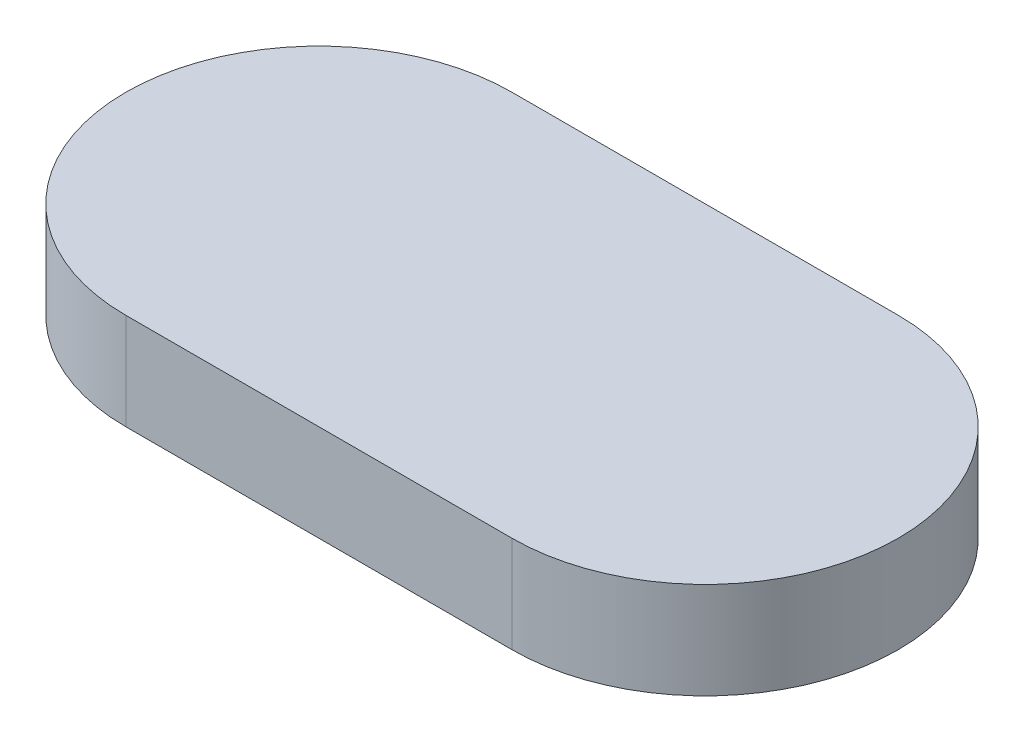
ISO-10303-21;
HEADER;
FILE_DESCRIPTION(('STEP AP214'),'2;1');
FILE_NAME('part.step','',(''),(''),'','','');
FILE_SCHEMA(('AUTOMOTIVE_DESIGN { 1 0 10303 214 1 1 1 1 }'));
ENDSEC;
DATA;
#1=APPLICATION_CONTEXT('core data for automotive mechanical design processes');
#2=APPLICATION_PROTOCOL_DEFINITION('international standard','automotive_design',2000,#1);
#3=PRODUCT_CONTEXT('',#1,'mechanical');
#4=PRODUCT('Part','Part','',(#3));
#5=PRODUCT_RELATED_PRODUCT_CATEGORY('part','',(#4));
#6=PRODUCT_DEFINITION_FORMATION('','',#4);
#7=PRODUCT_DEFINITION_CONTEXT('part definition',#1,'design');
#8=PRODUCT_DEFINITION('design','',#6,#7);
#9=PRODUCT_DEFINITION_SHAPE('','',#8);
#10=(LENGTH_UNIT() NAMED_UNIT(*) SI_UNIT(.MILLI.,.METRE.));
#11=(NAMED_UNIT(*) PLANE_ANGLE_UNIT() SI_UNIT($,.RADIAN.));
#12=(NAMED_UNIT(*) SI_UNIT($,.STERADIAN.) SOLID_ANGLE_UNIT());
#13=UNCERTAINTY_MEASURE_WITH_UNIT(LENGTH_MEASURE(1.E-05),#10,'distance_accuracy_value','');
#14=(GEOMETRIC_REPRESENTATION_CONTEXT(3) GLOBAL_UNCERTAINTY_ASSIGNED_CONTEXT((#13)) GLOBAL_UNIT_ASSIGNED_CONTEXT((#10,
#11,#12)) REPRESENTATION_CONTEXT('',''));
#15=CARTESIAN_POINT('',(0.,0.,0.));
#16=DIRECTION('',(0.,0.,1.));
#17=DIRECTION('',(1.,0.,0.));
#18=AXIS2_PLACEMENT_3D('',#15,#16,#17);
#19=CARTESIAN_POINT('',(0.,10.,0.));
#20=DIRECTION('',(0.,-1.,0.));
#21=DIRECTION('',(0.,0.,-1.));
#22=AXIS2_PLACEMENT_3D('',#19,#20,#21);
#23=CYLINDRICAL_SURFACE('',#22,20.);
#24=CARTESIAN_POINT('',(0.,0.,0.));
#25=DIRECTION('',(0.,1.,0.));
#26=DIRECTION('',(0.,0.,1.));
#27=AXIS2_PLACEMENT_3D('',#24,#25,#26);
#28=CIRCLE('',#27,20.);
#29=CARTESIAN_POINT('',(0.,0.,20.));
#30=VERTEX_POINT('',#29);
#31=CARTESIAN_POINT('',(0.,0.,-20.));
#32=VERTEX_POINT('',#31);
#33=EDGE_CURVE('E98',#30,#32,#28,.T.);
#34=ORIENTED_EDGE('',*,*,#33,.T.);
#35=DIRECTION('',(0.,-1.,0.));
#36=VECTOR('',#35,1.);
#37=CARTESIAN_POINT('',(0.,10.,-20.));
#38=LINE('',#37,#36);
#39=CARTESIAN_POINT('',(0.,10.,-20.));
#40=VERTEX_POINT('',#39);
#41=EDGE_CURVE('E11',#40,#32,#38,.T.);
#42=ORIENTED_EDGE('',*,*,#41,.F.);
#43=CARTESIAN_POINT('',(0.,10.,0.));
#44=DIRECTION('',(0.,1.,0.));
#45=DIRECTION('',(0.,0.,1.));
#46=AXIS2_PLACEMENT_3D('',#43,#44,#45);
#47=CIRCLE('',#46,20.);
#48=CARTESIAN_POINT('',(0.,10.,20.));
#49=VERTEX_POINT('',#48);
#50=EDGE_CURVE('E86',#49,#40,#47,.T.);
#51=ORIENTED_EDGE('',*,*,#50,.F.);
#52=DIRECTION('',(0.,-1.,0.));
#53=VECTOR('',#52,1.);
#54=CARTESIAN_POINT('',(0.,10.,20.));
#55=LINE('',#54,#53);
#56=EDGE_CURVE('E94',#49,#30,#55,.T.);
#57=ORIENTED_EDGE('',*,*,#56,.T.);
#58=EDGE_LOOP('',(#34,#42,#51,#57));
#59=FACE_BOUND('',#58,.T.);
#60=ADVANCED_FACE('F35',(#59),#23,.T.);
#61=CARTESIAN_POINT('',(0.,10.,-20.));
#62=DIRECTION('',(0.,0.,1.));
#63=DIRECTION('',(1.,0.,0.));
#64=AXIS2_PLACEMENT_3D('',#61,#62,#63);
#65=PLANE('',#64);
#66=DIRECTION('',(-1.,0.,0.));
#67=VECTOR('',#66,1.);
#68=CARTESIAN_POINT('',(0.,0.,-20.));
#69=LINE('',#68,#67);
#70=CARTESIAN_POINT('',(-40.,0.,-20.));
#71=VERTEX_POINT('',#70);
#72=EDGE_CURVE('E90',#32,#71,#69,.T.);
#73=ORIENTED_EDGE('',*,*,#72,.T.);
#74=DIRECTION('',(0.,-1.,0.));
#75=VECTOR('',#74,1.);
#76=CARTESIAN_POINT('',(-40.,10.,-20.));
#77=LINE('',#76,#75);
#78=CARTESIAN_POINT('',(-40.,10.,-20.));
#79=VERTEX_POINT('',#78);
#80=EDGE_CURVE('E43',#79,#71,#77,.T.);
#81=ORIENTED_EDGE('',*,*,#80,.F.);
#82=DIRECTION('',(-1.,0.,0.));
#83=VECTOR('',#82,1.);
#84=CARTESIAN_POINT('',(0.,10.,-20.));
#85=LINE('',#84,#83);
#86=EDGE_CURVE('E81',#40,#79,#85,.T.);
#87=ORIENTED_EDGE('',*,*,#86,.F.);
#88=ORIENTED_EDGE('',*,*,#41,.T.);
#89=EDGE_LOOP('',(#73,#81,#87,#88));
#90=FACE_BOUND('',#89,.T.);
#91=ADVANCED_FACE('F89',(#90),#65,.F.);
#92=CARTESIAN_POINT('',(-40.,10.,0.));
#93=DIRECTION('',(0.,-1.,0.));
#94=DIRECTION('',(0.,0.,-1.));
#95=AXIS2_PLACEMENT_3D('',#92,#93,#94);
#96=CYLINDRICAL_SURFACE('',#95,20.);
#97=CARTESIAN_POINT('',(-40.,0.,0.));
#98=DIRECTION('',(0.,1.,0.));
#99=DIRECTION('',(0.,0.,1.));
#100=AXIS2_PLACEMENT_3D('',#97,#98,#99);
#101=CIRCLE('',#100,20.);
#102=CARTESIAN_POINT('',(-40.,0.,20.));
#103=VERTEX_POINT('',#102);
#104=EDGE_CURVE('E68',#71,#103,#101,.T.);
#105=ORIENTED_EDGE('',*,*,#104,.T.);
#106=DIRECTION('',(0.,-1.,0.));
#107=VECTOR('',#106,1.);
#108=CARTESIAN_POINT('',(-40.,10.,20.));
#109=LINE('',#108,#107);
#110=CARTESIAN_POINT('',(-40.,10.,20.));
#111=VERTEX_POINT('',#110);
#112=EDGE_CURVE('E91',#111,#103,#109,.T.);
#113=ORIENTED_EDGE('',*,*,#112,.F.);
#114=CARTESIAN_POINT('',(-40.,10.,0.));
#115=DIRECTION('',(0.,1.,0.));
#116=DIRECTION('',(0.,0.,1.));
#117=AXIS2_PLACEMENT_3D('',#114,#115,#116);
#118=CIRCLE('',#117,20.);
#119=EDGE_CURVE('E84',#79,#111,#118,.T.);
#120=ORIENTED_EDGE('',*,*,#119,.F.);
#121=ORIENTED_EDGE('',*,*,#80,.T.);
#122=EDGE_LOOP('',(#105,#113,#120,#121));
#123=FACE_BOUND('',#122,.T.);
#124=ADVANCED_FACE('F92',(#123),#96,.T.);
#125=CARTESIAN_POINT('',(0.,10.,20.));
#126=DIRECTION('',(0.,0.,-1.));
#127=DIRECTION('',(-1.,0.,0.));
#128=AXIS2_PLACEMENT_3D('',#125,#126,#127);
#129=PLANE('',#128);
#130=DIRECTION('',(1.,0.,0.));
#131=VECTOR('',#130,1.);
#132=CARTESIAN_POINT('',(0.,0.,20.));
#133=LINE('',#132,#131);
#134=EDGE_CURVE('E74',#103,#30,#133,.T.);
#135=ORIENTED_EDGE('',*,*,#134,.T.);
#136=ORIENTED_EDGE('',*,*,#56,.F.);
#137=DIRECTION('',(1.,0.,0.));
#138=VECTOR('',#137,1.);
#139=CARTESIAN_POINT('',(0.,10.,20.));
#140=LINE('',#139,#138);
#141=EDGE_CURVE('E51',#111,#49,#140,.T.);
#142=ORIENTED_EDGE('',*,*,#141,.F.);
#143=ORIENTED_EDGE('',*,*,#112,.T.);
#144=EDGE_LOOP('',(#135,#136,#142,#143));
#145=FACE_BOUND('',#144,.T.);
#146=ADVANCED_FACE('F105',(#145),#129,.F.);
#147=CARTESIAN_POINT('',(0.,10.,0.));
#148=DIRECTION('',(0.,1.,0.));
#149=DIRECTION('',(0.,0.,1.));
#150=AXIS2_PLACEMENT_3D('',#147,#148,#149);
#151=PLANE('',#150);
#152=ORIENTED_EDGE('',*,*,#50,.T.);
#153=ORIENTED_EDGE('',*,*,#86,.T.);
#154=ORIENTED_EDGE('',*,*,#119,.T.);
#155=ORIENTED_EDGE('',*,*,#141,.T.);
#156=EDGE_LOOP('',(#152,#153,#154,#155));
#157=FACE_BOUND('',#156,.T.);
#158=ADVANCED_FACE('F82',(#157),#151,.T.);
#159=CARTESIAN_POINT('',(0.,0.,0.));
#160=DIRECTION('',(0.,1.,0.));
#161=DIRECTION('',(0.,0.,1.));
#162=AXIS2_PLACEMENT_3D('',#159,#160,#161);
#163=PLANE('',#162);
#164=ORIENTED_EDGE('',*,*,#33,.F.);
#165=ORIENTED_EDGE('',*,*,#134,.F.);
#166=ORIENTED_EDGE('',*,*,#104,.F.);
#167=ORIENTED_EDGE('',*,*,#72,.F.);
#168=EDGE_LOOP('',(#164,#165,#166,#167));
#169=FACE_BOUND('',#168,.T.);
#170=ADVANCED_FACE('F108',(#169),#163,.F.);
#171=CLOSED_SHELL('',(#60,#91,#124,#146,#158,#170));
#172=MANIFOLD_SOLID_BREP('B2',#171);
#173=ADVANCED_BREP_SHAPE_REPRESENTATION('',(#18,#172),#14);
#174=SHAPE_DEFINITION_REPRESENTATION(#9,#173);
ENDSEC;
END-ISO-10303-21;
